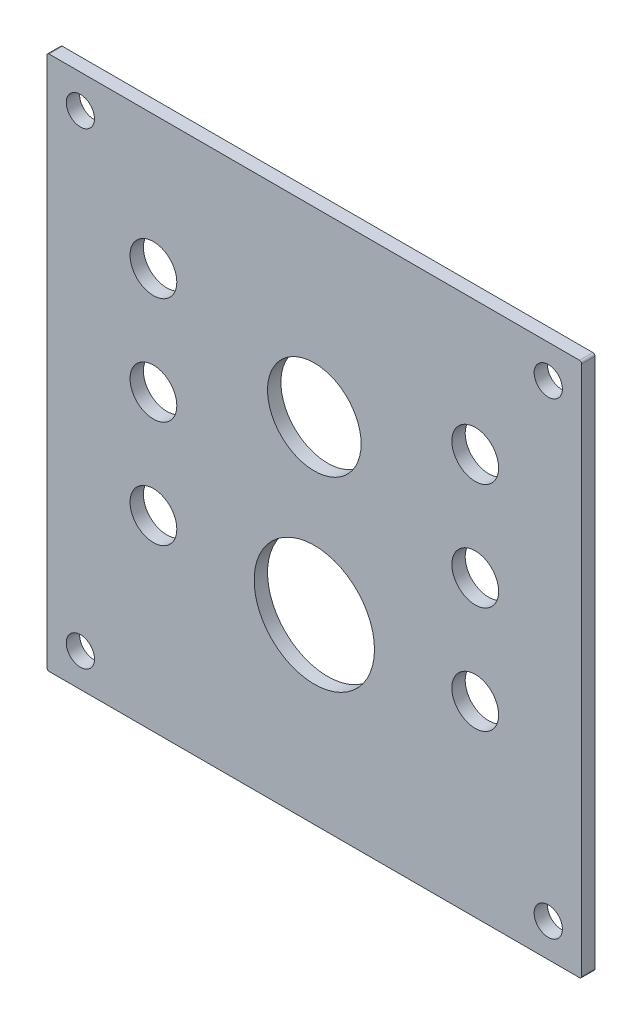
ISO-10303-21;
HEADER;
FILE_DESCRIPTION(('STEP AP214'),'2;1');
FILE_NAME('part.step','',(''),(''),'','','');
FILE_SCHEMA(('AUTOMOTIVE_DESIGN { 1 0 10303 214 1 1 1 1 }'));
ENDSEC;
DATA;
#1=APPLICATION_CONTEXT('core data for automotive mechanical design processes');
#2=APPLICATION_PROTOCOL_DEFINITION('international standard','automotive_design',2000,#1);
#3=PRODUCT_CONTEXT('',#1,'mechanical');
#4=PRODUCT('Part','Part','',(#3));
#5=PRODUCT_RELATED_PRODUCT_CATEGORY('part','',(#4));
#6=PRODUCT_DEFINITION_FORMATION('','',#4);
#7=PRODUCT_DEFINITION_CONTEXT('part definition',#1,'design');
#8=PRODUCT_DEFINITION('design','',#6,#7);
#9=PRODUCT_DEFINITION_SHAPE('','',#8);
#10=(LENGTH_UNIT() NAMED_UNIT(*) SI_UNIT(.MILLI.,.METRE.));
#11=(NAMED_UNIT(*) PLANE_ANGLE_UNIT() SI_UNIT($,.RADIAN.));
#12=(NAMED_UNIT(*) SI_UNIT($,.STERADIAN.) SOLID_ANGLE_UNIT());
#13=UNCERTAINTY_MEASURE_WITH_UNIT(LENGTH_MEASURE(1.E-05),#10,'distance_accuracy_value','');
#14=(GEOMETRIC_REPRESENTATION_CONTEXT(3) GLOBAL_UNCERTAINTY_ASSIGNED_CONTEXT((#13)) GLOBAL_UNIT_ASSIGNED_CONTEXT((#10,
#11,#12)) REPRESENTATION_CONTEXT('',''));
#15=CARTESIAN_POINT('',(0.,0.,0.));
#16=DIRECTION('',(0.,0.,1.));
#17=DIRECTION('',(1.,0.,0.));
#18=AXIS2_PLACEMENT_3D('',#15,#16,#17);
#19=CARTESIAN_POINT('',(-63.5,63.5,11.5875));
#20=DIRECTION('',(1.,0.,0.));
#21=DIRECTION('',(0.,1.,0.));
#22=AXIS2_PLACEMENT_3D('',#19,#20,#21);
#23=PLANE('',#22);
#24=DIRECTION('',(0.,-1.,0.));
#25=VECTOR('',#24,1.);
#26=CARTESIAN_POINT('',(-63.5,63.5,8.4125));
#27=LINE('',#26,#25);
#28=CARTESIAN_POINT('',(-63.5,62.992,8.4125));
#29=VERTEX_POINT('',#28);
#30=CARTESIAN_POINT('',(-63.5,-62.992,8.4125));
#31=VERTEX_POINT('',#30);
#32=EDGE_CURVE('E113',#29,#31,#27,.T.);
#33=ORIENTED_EDGE('',*,*,#32,.T.);
#34=DIRECTION('',(0.,0.,-1.));
#35=VECTOR('',#34,1.);
#36=CARTESIAN_POINT('',(-63.5,-62.992,11.5875));
#37=LINE('',#36,#35);
#38=CARTESIAN_POINT('',(-63.5,-62.992,11.5875));
#39=VERTEX_POINT('',#38);
#40=EDGE_CURVE('E57',#31,#39,#37,.F.);
#41=ORIENTED_EDGE('',*,*,#40,.T.);
#42=DIRECTION('',(0.,-1.,0.));
#43=VECTOR('',#42,1.);
#44=CARTESIAN_POINT('',(-63.5,63.5,11.5875));
#45=LINE('',#44,#43);
#46=CARTESIAN_POINT('',(-63.5,62.992,11.5875));
#47=VERTEX_POINT('',#46);
#48=EDGE_CURVE('E190',#47,#39,#45,.T.);
#49=ORIENTED_EDGE('',*,*,#48,.F.);
#50=DIRECTION('',(0.,0.,-1.));
#51=VECTOR('',#50,1.);
#52=CARTESIAN_POINT('',(-63.5,62.992,11.5875));
#53=LINE('',#52,#51);
#54=EDGE_CURVE('E203',#47,#29,#53,.T.);
#55=ORIENTED_EDGE('',*,*,#54,.T.);
#56=EDGE_LOOP('',(#33,#41,#49,#55));
#57=FACE_BOUND('',#56,.T.);
#58=ADVANCED_FACE('F36',(#57),#23,.F.);
#59=CARTESIAN_POINT('',(-63.5,-63.5,11.5875));
#60=DIRECTION('',(0.,1.,0.));
#61=DIRECTION('',(-1.,0.,0.));
#62=AXIS2_PLACEMENT_3D('',#59,#60,#61);
#63=PLANE('',#62);
#64=DIRECTION('',(1.,0.,0.));
#65=VECTOR('',#64,1.);
#66=CARTESIAN_POINT('',(-63.5,-63.5,11.5875));
#67=LINE('',#66,#65);
#68=CARTESIAN_POINT('',(-62.992,-63.5,11.5875));
#69=VERTEX_POINT('',#68);
#70=CARTESIAN_POINT('',(62.992,-63.5,11.5875));
#71=VERTEX_POINT('',#70);
#72=EDGE_CURVE('E192',#69,#71,#67,.T.);
#73=ORIENTED_EDGE('',*,*,#72,.F.);
#74=DIRECTION('',(0.,0.,-1.));
#75=VECTOR('',#74,1.);
#76=CARTESIAN_POINT('',(-62.992,-63.5,11.5875));
#77=LINE('',#76,#75);
#78=CARTESIAN_POINT('',(-62.992,-63.5,8.4125));
#79=VERTEX_POINT('',#78);
#80=EDGE_CURVE('E110',#69,#79,#77,.T.);
#81=ORIENTED_EDGE('',*,*,#80,.T.);
#82=DIRECTION('',(1.,0.,0.));
#83=VECTOR('',#82,1.);
#84=CARTESIAN_POINT('',(-63.5,-63.5,8.4125));
#85=LINE('',#84,#83);
#86=CARTESIAN_POINT('',(62.992,-63.5,8.4125));
#87=VERTEX_POINT('',#86);
#88=EDGE_CURVE('E103',#79,#87,#85,.T.);
#89=ORIENTED_EDGE('',*,*,#88,.T.);
#90=DIRECTION('',(0.,0.,-1.));
#91=VECTOR('',#90,1.);
#92=CARTESIAN_POINT('',(62.992,-63.5,11.5875));
#93=LINE('',#92,#91);
#94=EDGE_CURVE('E108',#71,#87,#93,.T.);
#95=ORIENTED_EDGE('',*,*,#94,.F.);
#96=EDGE_LOOP('',(#73,#81,#89,#95));
#97=FACE_BOUND('',#96,.T.);
#98=ADVANCED_FACE('F106',(#97),#63,.F.);
#99=CARTESIAN_POINT('',(0.,63.5,11.5875));
#100=DIRECTION('',(0.,-1.,0.));
#101=DIRECTION('',(1.,0.,0.));
#102=AXIS2_PLACEMENT_3D('',#99,#100,#101);
#103=PLANE('',#102);
#104=DIRECTION('',(-1.,0.,0.));
#105=VECTOR('',#104,1.);
#106=CARTESIAN_POINT('',(0.,63.5,8.4125));
#107=LINE('',#106,#105);
#108=CARTESIAN_POINT('',(62.992,63.5,8.4125));
#109=VERTEX_POINT('',#108);
#110=CARTESIAN_POINT('',(-62.992,63.5,8.4125));
#111=VERTEX_POINT('',#110);
#112=EDGE_CURVE('E112',#109,#111,#107,.T.);
#113=ORIENTED_EDGE('',*,*,#112,.T.);
#114=DIRECTION('',(0.,0.,-1.));
#115=VECTOR('',#114,1.);
#116=CARTESIAN_POINT('',(-62.992,63.5,11.5875));
#117=LINE('',#116,#115);
#118=CARTESIAN_POINT('',(-62.992,63.5,11.5875));
#119=VERTEX_POINT('',#118);
#120=EDGE_CURVE('E11',#111,#119,#117,.F.);
#121=ORIENTED_EDGE('',*,*,#120,.T.);
#122=DIRECTION('',(-1.,0.,0.));
#123=VECTOR('',#122,1.);
#124=CARTESIAN_POINT('',(0.,63.5,11.5875));
#125=LINE('',#124,#123);
#126=CARTESIAN_POINT('',(62.992,63.5,11.5875));
#127=VERTEX_POINT('',#126);
#128=EDGE_CURVE('E194',#127,#119,#125,.T.);
#129=ORIENTED_EDGE('',*,*,#128,.F.);
#130=DIRECTION('',(0.,0.,-1.));
#131=VECTOR('',#130,1.);
#132=CARTESIAN_POINT('',(62.992,63.5,11.5875));
#133=LINE('',#132,#131);
#134=EDGE_CURVE('E145',#109,#127,#133,.F.);
#135=ORIENTED_EDGE('',*,*,#134,.F.);
#136=EDGE_LOOP('',(#113,#121,#129,#135));
#137=FACE_BOUND('',#136,.T.);
#138=ADVANCED_FACE('F219',(#137),#103,.F.);
#139=CARTESIAN_POINT('',(-63.5,-63.5,11.5875));
#140=DIRECTION('',(0.,0.,1.));
#141=DIRECTION('',(1.,0.,0.));
#142=AXIS2_PLACEMENT_3D('',#139,#140,#141);
#143=PLANE('',#142);
#144=CARTESIAN_POINT('',(0.,-20.3454,11.5875));
#145=DIRECTION('',(0.,0.,1.));
#146=DIRECTION('',(1.,0.,0.));
#147=AXIS2_PLACEMENT_3D('',#144,#145,#146);
#148=CIRCLE('',#147,14.2875);
#149=CARTESIAN_POINT('',(14.2875,-20.3454,11.5875));
#150=VERTEX_POINT('',#149);
#151=EDGE_CURVE('E170',#150,#150,#148,.T.);
#152=ORIENTED_EDGE('',*,*,#151,.F.);
#153=EDGE_LOOP('',(#152));
#154=FACE_BOUND('',#153,.T.);
#155=CARTESIAN_POINT('',(0.,20.3454,11.5875));
#156=DIRECTION('',(0.,0.,1.));
#157=DIRECTION('',(1.,0.,0.));
#158=AXIS2_PLACEMENT_3D('',#155,#156,#157);
#159=CIRCLE('',#158,11.1125);
#160=CARTESIAN_POINT('',(11.1125,20.3454,11.5875));
#161=VERTEX_POINT('',#160);
#162=EDGE_CURVE('E176',#161,#161,#159,.T.);
#163=ORIENTED_EDGE('',*,*,#162,.F.);
#164=EDGE_LOOP('',(#163));
#165=FACE_BOUND('',#164,.T.);
#166=CARTESIAN_POINT('',(-38.2148079999995,-19.05,11.5875));
#167=DIRECTION('',(0.,0.,1.));
#168=DIRECTION('',(1.,0.,0.));
#169=AXIS2_PLACEMENT_3D('',#166,#167,#168);
#170=CIRCLE('',#169,5.55625);
#171=CARTESIAN_POINT('',(-32.6585579999995,-19.05,11.5875));
#172=VERTEX_POINT('',#171);
#173=EDGE_CURVE('E148',#172,#172,#170,.T.);
#174=ORIENTED_EDGE('',*,*,#173,.F.);
#175=EDGE_LOOP('',(#174));
#176=FACE_BOUND('',#175,.T.);
#177=CARTESIAN_POINT('',(-55.5625,55.5625,11.5875));
#178=DIRECTION('',(0.,0.,1.));
#179=DIRECTION('',(1.,0.,0.));
#180=AXIS2_PLACEMENT_3D('',#177,#178,#179);
#181=CIRCLE('',#180,3.3528);
#182=CARTESIAN_POINT('',(-52.2097,55.5625,11.5875));
#183=VERTEX_POINT('',#182);
#184=EDGE_CURVE('E152',#183,#183,#181,.T.);
#185=ORIENTED_EDGE('',*,*,#184,.F.);
#186=EDGE_LOOP('',(#185));
#187=FACE_BOUND('',#186,.T.);
#188=CARTESIAN_POINT('',(-38.2148079999999,31.75,11.5875));
#189=DIRECTION('',(0.,0.,1.));
#190=DIRECTION('',(1.,0.,0.));
#191=AXIS2_PLACEMENT_3D('',#188,#189,#190);
#192=CIRCLE('',#191,5.55624999999993);
#193=CARTESIAN_POINT('',(-32.658558,31.75,11.5875));
#194=VERTEX_POINT('',#193);
#195=EDGE_CURVE('E158',#194,#194,#192,.T.);
#196=ORIENTED_EDGE('',*,*,#195,.F.);
#197=EDGE_LOOP('',(#196));
#198=FACE_BOUND('',#197,.T.);
#199=CARTESIAN_POINT('',(-38.2148079999999,6.34999999999999,11.5875));
#200=DIRECTION('',(0.,0.,1.));
#201=DIRECTION('',(1.,0.,0.));
#202=AXIS2_PLACEMENT_3D('',#199,#200,#201);
#203=CIRCLE('',#202,5.55625000000017);
#204=CARTESIAN_POINT('',(-32.6585579999998,6.34999999999999,11.5875));
#205=VERTEX_POINT('',#204);
#206=EDGE_CURVE('E164',#205,#205,#203,.T.);
#207=ORIENTED_EDGE('',*,*,#206,.F.);
#208=EDGE_LOOP('',(#207));
#209=FACE_BOUND('',#208,.T.);
#210=ORIENTED_EDGE('',*,*,#48,.T.);
#211=CARTESIAN_POINT('',(-62.992,-62.992,11.5875));
#212=DIRECTION('',(0.,0.,1.));
#213=DIRECTION('',(1.,0.,0.));
#214=AXIS2_PLACEMENT_3D('',#211,#212,#213);
#215=CIRCLE('',#214,0.508);
#216=EDGE_CURVE('E44',#39,#69,#215,.T.);
#217=ORIENTED_EDGE('',*,*,#216,.T.);
#218=ORIENTED_EDGE('',*,*,#72,.T.);
#219=CARTESIAN_POINT('',(62.992,-62.992,11.5875));
#220=DIRECTION('',(0.,0.,-1.));
#221=DIRECTION('',(-1.,0.,0.));
#222=AXIS2_PLACEMENT_3D('',#219,#220,#221);
#223=CIRCLE('',#222,0.508);
#224=CARTESIAN_POINT('',(63.5,-62.992,11.5875));
#225=VERTEX_POINT('',#224);
#226=EDGE_CURVE('E129',#225,#71,#223,.T.);
#227=ORIENTED_EDGE('',*,*,#226,.F.);
#228=DIRECTION('',(0.,-1.,0.));
#229=VECTOR('',#228,1.);
#230=CARTESIAN_POINT('',(63.5,63.5,11.5875));
#231=LINE('',#230,#229);
#232=CARTESIAN_POINT('',(63.5,62.992,11.5875));
#233=VERTEX_POINT('',#232);
#234=EDGE_CURVE('E130',#233,#225,#231,.T.);
#235=ORIENTED_EDGE('',*,*,#234,.F.);
#236=CARTESIAN_POINT('',(62.992,62.992,11.5875));
#237=DIRECTION('',(0.,0.,-1.));
#238=DIRECTION('',(-1.,0.,0.));
#239=AXIS2_PLACEMENT_3D('',#236,#237,#238);
#240=CIRCLE('',#239,0.508);
#241=EDGE_CURVE('E142',#127,#233,#240,.T.);
#242=ORIENTED_EDGE('',*,*,#241,.F.);
#243=ORIENTED_EDGE('',*,*,#128,.T.);
#244=CARTESIAN_POINT('',(-62.992,62.992,11.5875));
#245=DIRECTION('',(0.,0.,1.));
#246=DIRECTION('',(1.,0.,0.));
#247=AXIS2_PLACEMENT_3D('',#244,#245,#246);
#248=CIRCLE('',#247,0.508);
#249=EDGE_CURVE('E207',#119,#47,#248,.T.);
#250=ORIENTED_EDGE('',*,*,#249,.T.);
#251=EDGE_LOOP('',(#210,#217,#218,#227,#235,#242,#243,#250));
#252=FACE_BOUND('',#251,.T.);
#253=CARTESIAN_POINT('',(-55.5625,-55.5625,11.5875));
#254=DIRECTION('',(0.,0.,1.));
#255=DIRECTION('',(-1.,0.,0.));
#256=AXIS2_PLACEMENT_3D('',#253,#254,#255);
#257=CIRCLE('',#256,3.3528);
#258=CARTESIAN_POINT('',(-58.9153,-55.5625,11.5875));
#259=VERTEX_POINT('',#258);
#260=EDGE_CURVE('E182',#259,#259,#257,.T.);
#261=ORIENTED_EDGE('',*,*,#260,.F.);
#262=EDGE_LOOP('',(#261));
#263=FACE_BOUND('',#262,.T.);
#264=CARTESIAN_POINT('',(38.2148079999995,-19.05,11.5875));
#265=DIRECTION('',(0.,0.,-1.));
#266=DIRECTION('',(-1.,0.,0.));
#267=AXIS2_PLACEMENT_3D('',#264,#265,#266);
#268=CIRCLE('',#267,5.55625);
#269=CARTESIAN_POINT('',(32.6585579999995,-19.05,11.5875));
#270=VERTEX_POINT('',#269);
#271=EDGE_CURVE('E255',#270,#270,#268,.T.);
#272=ORIENTED_EDGE('',*,*,#271,.T.);
#273=EDGE_LOOP('',(#272));
#274=FACE_BOUND('',#273,.T.);
#275=CARTESIAN_POINT('',(55.5625,55.5625,11.5875));
#276=DIRECTION('',(0.,0.,-1.));
#277=DIRECTION('',(-1.,0.,0.));
#278=AXIS2_PLACEMENT_3D('',#275,#276,#277);
#279=CIRCLE('',#278,3.3528);
#280=CARTESIAN_POINT('',(52.2097,55.5625,11.5875));
#281=VERTEX_POINT('',#280);
#282=EDGE_CURVE('E249',#281,#281,#279,.T.);
#283=ORIENTED_EDGE('',*,*,#282,.T.);
#284=EDGE_LOOP('',(#283));
#285=FACE_BOUND('',#284,.T.);
#286=CARTESIAN_POINT('',(38.2148079999999,31.75,11.5875));
#287=DIRECTION('',(0.,0.,-1.));
#288=DIRECTION('',(-1.,0.,0.));
#289=AXIS2_PLACEMENT_3D('',#286,#287,#288);
#290=CIRCLE('',#289,5.55624999999993);
#291=CARTESIAN_POINT('',(32.658558,31.75,11.5875));
#292=VERTEX_POINT('',#291);
#293=EDGE_CURVE('E243',#292,#292,#290,.T.);
#294=ORIENTED_EDGE('',*,*,#293,.T.);
#295=EDGE_LOOP('',(#294));
#296=FACE_BOUND('',#295,.T.);
#297=CARTESIAN_POINT('',(38.2148079999999,6.34999999999999,11.5875));
#298=DIRECTION('',(0.,0.,-1.));
#299=DIRECTION('',(-1.,0.,0.));
#300=AXIS2_PLACEMENT_3D('',#297,#298,#299);
#301=CIRCLE('',#300,5.55625000000017);
#302=CARTESIAN_POINT('',(32.6585579999998,6.34999999999999,11.5875));
#303=VERTEX_POINT('',#302);
#304=EDGE_CURVE('E237',#303,#303,#301,.T.);
#305=ORIENTED_EDGE('',*,*,#304,.T.);
#306=EDGE_LOOP('',(#305));
#307=FACE_BOUND('',#306,.T.);
#308=CARTESIAN_POINT('',(55.5625,-55.5625,11.5875));
#309=DIRECTION('',(0.,0.,-1.));
#310=DIRECTION('',(1.,0.,0.));
#311=AXIS2_PLACEMENT_3D('',#308,#309,#310);
#312=CIRCLE('',#311,3.3528);
#313=CARTESIAN_POINT('',(58.9153,-55.5625,11.5875));
#314=VERTEX_POINT('',#313);
#315=EDGE_CURVE('E229',#314,#314,#312,.T.);
#316=ORIENTED_EDGE('',*,*,#315,.T.);
#317=EDGE_LOOP('',(#316));
#318=FACE_BOUND('',#317,.T.);
#319=ADVANCED_FACE('F210',(#154,#165,#176,#187,#198,#209,#252,#263,#274,#285,#296,#307,#318),
#143,.T.);
#320=CARTESIAN_POINT('',(-63.5,-63.5,8.4125));
#321=DIRECTION('',(0.,0.,1.));
#322=DIRECTION('',(1.,0.,0.));
#323=AXIS2_PLACEMENT_3D('',#320,#321,#322);
#324=PLANE('',#323);
#325=CARTESIAN_POINT('',(0.,-20.3454,8.4125));
#326=DIRECTION('',(0.,0.,1.));
#327=DIRECTION('',(1.,0.,0.));
#328=AXIS2_PLACEMENT_3D('',#325,#326,#327);
#329=CIRCLE('',#328,14.2875);
#330=CARTESIAN_POINT('',(14.2875,-20.3454,8.4125));
#331=VERTEX_POINT('',#330);
#332=EDGE_CURVE('E173',#331,#331,#329,.T.);
#333=ORIENTED_EDGE('',*,*,#332,.T.);
#334=EDGE_LOOP('',(#333));
#335=FACE_BOUND('',#334,.T.);
#336=CARTESIAN_POINT('',(0.,20.3454,8.4125));
#337=DIRECTION('',(0.,0.,1.));
#338=DIRECTION('',(1.,0.,0.));
#339=AXIS2_PLACEMENT_3D('',#336,#337,#338);
#340=CIRCLE('',#339,11.1125);
#341=CARTESIAN_POINT('',(11.1125,20.3454,8.4125));
#342=VERTEX_POINT('',#341);
#343=EDGE_CURVE('E179',#342,#342,#340,.T.);
#344=ORIENTED_EDGE('',*,*,#343,.T.);
#345=EDGE_LOOP('',(#344));
#346=FACE_BOUND('',#345,.T.);
#347=CARTESIAN_POINT('',(-38.2148079999995,-19.05,8.4125));
#348=DIRECTION('',(0.,0.,1.));
#349=DIRECTION('',(1.,0.,0.));
#350=AXIS2_PLACEMENT_3D('',#347,#348,#349);
#351=CIRCLE('',#350,5.55625);
#352=CARTESIAN_POINT('',(-32.6585579999995,-19.05,8.4125));
#353=VERTEX_POINT('',#352);
#354=EDGE_CURVE('E149',#353,#353,#351,.T.);
#355=ORIENTED_EDGE('',*,*,#354,.T.);
#356=EDGE_LOOP('',(#355));
#357=FACE_BOUND('',#356,.T.);
#358=CARTESIAN_POINT('',(-55.5625,55.5625,8.4125));
#359=DIRECTION('',(0.,0.,1.));
#360=DIRECTION('',(1.,0.,0.));
#361=AXIS2_PLACEMENT_3D('',#358,#359,#360);
#362=CIRCLE('',#361,3.3528);
#363=CARTESIAN_POINT('',(-52.2097,55.5625,8.4125));
#364=VERTEX_POINT('',#363);
#365=EDGE_CURVE('E155',#364,#364,#362,.T.);
#366=ORIENTED_EDGE('',*,*,#365,.T.);
#367=EDGE_LOOP('',(#366));
#368=FACE_BOUND('',#367,.T.);
#369=CARTESIAN_POINT('',(-38.2148079999999,31.75,8.4125));
#370=DIRECTION('',(0.,0.,1.));
#371=DIRECTION('',(1.,0.,0.));
#372=AXIS2_PLACEMENT_3D('',#369,#370,#371);
#373=CIRCLE('',#372,5.55624999999993);
#374=CARTESIAN_POINT('',(-32.658558,31.75,8.4125));
#375=VERTEX_POINT('',#374);
#376=EDGE_CURVE('E161',#375,#375,#373,.T.);
#377=ORIENTED_EDGE('',*,*,#376,.T.);
#378=EDGE_LOOP('',(#377));
#379=FACE_BOUND('',#378,.T.);
#380=CARTESIAN_POINT('',(-38.2148079999999,6.34999999999999,8.4125));
#381=DIRECTION('',(0.,0.,1.));
#382=DIRECTION('',(1.,0.,0.));
#383=AXIS2_PLACEMENT_3D('',#380,#381,#382);
#384=CIRCLE('',#383,5.55625000000017);
#385=CARTESIAN_POINT('',(-32.6585579999998,6.34999999999999,8.4125));
#386=VERTEX_POINT('',#385);
#387=EDGE_CURVE('E167',#386,#386,#384,.T.);
#388=ORIENTED_EDGE('',*,*,#387,.T.);
#389=EDGE_LOOP('',(#388));
#390=FACE_BOUND('',#389,.T.);
#391=CARTESIAN_POINT('',(-55.5625,-55.5625,8.4125));
#392=DIRECTION('',(0.,0.,1.));
#393=DIRECTION('',(-1.,0.,0.));
#394=AXIS2_PLACEMENT_3D('',#391,#392,#393);
#395=CIRCLE('',#394,3.3528);
#396=CARTESIAN_POINT('',(-58.9153,-55.5625,8.4125));
#397=VERTEX_POINT('',#396);
#398=EDGE_CURVE('E185',#397,#397,#395,.T.);
#399=ORIENTED_EDGE('',*,*,#398,.T.);
#400=EDGE_LOOP('',(#399));
#401=FACE_BOUND('',#400,.T.);
#402=ORIENTED_EDGE('',*,*,#88,.F.);
#403=CARTESIAN_POINT('',(-62.992,-62.992,8.4125));
#404=DIRECTION('',(0.,0.,1.));
#405=DIRECTION('',(1.,0.,0.));
#406=AXIS2_PLACEMENT_3D('',#403,#404,#405);
#407=CIRCLE('',#406,0.508);
#408=EDGE_CURVE('E201',#79,#31,#407,.F.);
#409=ORIENTED_EDGE('',*,*,#408,.T.);
#410=ORIENTED_EDGE('',*,*,#32,.F.);
#411=CARTESIAN_POINT('',(-62.992,62.992,8.4125));
#412=DIRECTION('',(0.,0.,1.));
#413=DIRECTION('',(1.,0.,0.));
#414=AXIS2_PLACEMENT_3D('',#411,#412,#413);
#415=CIRCLE('',#414,0.508);
#416=EDGE_CURVE('E199',#29,#111,#415,.F.);
#417=ORIENTED_EDGE('',*,*,#416,.T.);
#418=ORIENTED_EDGE('',*,*,#112,.F.);
#419=CARTESIAN_POINT('',(62.992,62.992,8.4125));
#420=DIRECTION('',(0.,0.,-1.));
#421=DIRECTION('',(-1.,0.,0.));
#422=AXIS2_PLACEMENT_3D('',#419,#420,#421);
#423=CIRCLE('',#422,0.508);
#424=CARTESIAN_POINT('',(63.5,62.992,8.4125));
#425=VERTEX_POINT('',#424);
#426=EDGE_CURVE('E125',#425,#109,#423,.F.);
#427=ORIENTED_EDGE('',*,*,#426,.F.);
#428=DIRECTION('',(0.,-1.,0.));
#429=VECTOR('',#428,1.);
#430=CARTESIAN_POINT('',(63.5,63.5,8.4125));
#431=LINE('',#430,#429);
#432=CARTESIAN_POINT('',(63.5,-62.992,8.4125));
#433=VERTEX_POINT('',#432);
#434=EDGE_CURVE('E120',#425,#433,#431,.T.);
#435=ORIENTED_EDGE('',*,*,#434,.T.);
#436=CARTESIAN_POINT('',(62.992,-62.992,8.4125));
#437=DIRECTION('',(0.,0.,-1.));
#438=DIRECTION('',(-1.,0.,0.));
#439=AXIS2_PLACEMENT_3D('',#436,#437,#438);
#440=CIRCLE('',#439,0.508);
#441=EDGE_CURVE('E116',#87,#433,#440,.F.);
#442=ORIENTED_EDGE('',*,*,#441,.F.);
#443=EDGE_LOOP('',(#402,#409,#410,#417,#418,#427,#435,#442));
#444=FACE_BOUND('',#443,.T.);
#445=CARTESIAN_POINT('',(38.2148079999995,-19.05,8.4125));
#446=DIRECTION('',(0.,0.,-1.));
#447=DIRECTION('',(-1.,0.,0.));
#448=AXIS2_PLACEMENT_3D('',#445,#446,#447);
#449=CIRCLE('',#448,5.55625);
#450=CARTESIAN_POINT('',(32.6585579999995,-19.05,8.4125));
#451=VERTEX_POINT('',#450);
#452=EDGE_CURVE('E252',#451,#451,#449,.T.);
#453=ORIENTED_EDGE('',*,*,#452,.F.);
#454=EDGE_LOOP('',(#453));
#455=FACE_BOUND('',#454,.T.);
#456=CARTESIAN_POINT('',(55.5625,55.5625,8.4125));
#457=DIRECTION('',(0.,0.,-1.));
#458=DIRECTION('',(-1.,0.,0.));
#459=AXIS2_PLACEMENT_3D('',#456,#457,#458);
#460=CIRCLE('',#459,3.3528);
#461=CARTESIAN_POINT('',(52.2097,55.5625,8.4125));
#462=VERTEX_POINT('',#461);
#463=EDGE_CURVE('E246',#462,#462,#460,.T.);
#464=ORIENTED_EDGE('',*,*,#463,.F.);
#465=EDGE_LOOP('',(#464));
#466=FACE_BOUND('',#465,.T.);
#467=CARTESIAN_POINT('',(38.2148079999999,31.75,8.4125));
#468=DIRECTION('',(0.,0.,-1.));
#469=DIRECTION('',(-1.,0.,0.));
#470=AXIS2_PLACEMENT_3D('',#467,#468,#469);
#471=CIRCLE('',#470,5.55624999999993);
#472=CARTESIAN_POINT('',(32.658558,31.75,8.4125));
#473=VERTEX_POINT('',#472);
#474=EDGE_CURVE('E240',#473,#473,#471,.T.);
#475=ORIENTED_EDGE('',*,*,#474,.F.);
#476=EDGE_LOOP('',(#475));
#477=FACE_BOUND('',#476,.T.);
#478=CARTESIAN_POINT('',(38.2148079999999,6.34999999999999,8.4125));
#479=DIRECTION('',(0.,0.,-1.));
#480=DIRECTION('',(-1.,0.,0.));
#481=AXIS2_PLACEMENT_3D('',#478,#479,#480);
#482=CIRCLE('',#481,5.55625000000017);
#483=CARTESIAN_POINT('',(32.6585579999998,6.34999999999999,8.4125));
#484=VERTEX_POINT('',#483);
#485=EDGE_CURVE('E234',#484,#484,#482,.T.);
#486=ORIENTED_EDGE('',*,*,#485,.F.);
#487=EDGE_LOOP('',(#486));
#488=FACE_BOUND('',#487,.T.);
#489=CARTESIAN_POINT('',(55.5625,-55.5625,8.4125));
#490=DIRECTION('',(0.,0.,-1.));
#491=DIRECTION('',(1.,0.,0.));
#492=AXIS2_PLACEMENT_3D('',#489,#490,#491);
#493=CIRCLE('',#492,3.3528);
#494=CARTESIAN_POINT('',(58.9153,-55.5625,8.4125));
#495=VERTEX_POINT('',#494);
#496=EDGE_CURVE('E227',#495,#495,#493,.T.);
#497=ORIENTED_EDGE('',*,*,#496,.F.);
#498=EDGE_LOOP('',(#497));
#499=FACE_BOUND('',#498,.T.);
#500=ADVANCED_FACE('F117',(#335,#346,#357,#368,#379,#390,#401,#444,#455,#466,#477,#488,#499),
#324,.F.);
#501=CARTESIAN_POINT('',(-55.5625,-55.5625,8.4125));
#502=DIRECTION('',(0.,0.,1.));
#503=DIRECTION('',(1.,0.,0.));
#504=AXIS2_PLACEMENT_3D('',#501,#502,#503);
#505=CYLINDRICAL_SURFACE('',#504,3.3528);
#506=ORIENTED_EDGE('',*,*,#398,.F.);
#507=EDGE_LOOP('',(#506));
#508=FACE_BOUND('',#507,.T.);
#509=ORIENTED_EDGE('',*,*,#260,.T.);
#510=EDGE_LOOP('',(#509));
#511=FACE_BOUND('',#510,.T.);
#512=ADVANCED_FACE('F265',(#508,#511),#505,.F.);
#513=CARTESIAN_POINT('',(0.,20.3454,8.4125));
#514=DIRECTION('',(0.,0.,1.));
#515=DIRECTION('',(1.,0.,0.));
#516=AXIS2_PLACEMENT_3D('',#513,#514,#515);
#517=CYLINDRICAL_SURFACE('',#516,11.1125);
#518=ORIENTED_EDGE('',*,*,#162,.T.);
#519=EDGE_LOOP('',(#518));
#520=FACE_BOUND('',#519,.T.);
#521=ORIENTED_EDGE('',*,*,#343,.F.);
#522=EDGE_LOOP('',(#521));
#523=FACE_BOUND('',#522,.T.);
#524=ADVANCED_FACE('F332',(#520,#523),#517,.F.);
#525=CARTESIAN_POINT('',(0.,-20.3454,8.4125));
#526=DIRECTION('',(0.,0.,1.));
#527=DIRECTION('',(1.,0.,0.));
#528=AXIS2_PLACEMENT_3D('',#525,#526,#527);
#529=CYLINDRICAL_SURFACE('',#528,14.2875);
#530=ORIENTED_EDGE('',*,*,#151,.T.);
#531=EDGE_LOOP('',(#530));
#532=FACE_BOUND('',#531,.T.);
#533=ORIENTED_EDGE('',*,*,#332,.F.);
#534=EDGE_LOOP('',(#533));
#535=FACE_BOUND('',#534,.T.);
#536=ADVANCED_FACE('F328',(#532,#535),#529,.F.);
#537=CARTESIAN_POINT('',(-38.2148079999999,6.34999999999999,8.4125));
#538=DIRECTION('',(0.,0.,1.));
#539=DIRECTION('',(1.,0.,0.));
#540=AXIS2_PLACEMENT_3D('',#537,#538,#539);
#541=CYLINDRICAL_SURFACE('',#540,5.55625000000017);
#542=ORIENTED_EDGE('',*,*,#387,.F.);
#543=EDGE_LOOP('',(#542));
#544=FACE_BOUND('',#543,.T.);
#545=ORIENTED_EDGE('',*,*,#206,.T.);
#546=EDGE_LOOP('',(#545));
#547=FACE_BOUND('',#546,.T.);
#548=ADVANCED_FACE('F324',(#544,#547),#541,.F.);
#549=CARTESIAN_POINT('',(-38.2148079999999,31.75,8.4125));
#550=DIRECTION('',(0.,0.,1.));
#551=DIRECTION('',(1.,0.,0.));
#552=AXIS2_PLACEMENT_3D('',#549,#550,#551);
#553=CYLINDRICAL_SURFACE('',#552,5.55624999999993);
#554=ORIENTED_EDGE('',*,*,#376,.F.);
#555=EDGE_LOOP('',(#554));
#556=FACE_BOUND('',#555,.T.);
#557=ORIENTED_EDGE('',*,*,#195,.T.);
#558=EDGE_LOOP('',(#557));
#559=FACE_BOUND('',#558,.T.);
#560=ADVANCED_FACE('F314',(#556,#559),#553,.F.);
#561=CARTESIAN_POINT('',(-55.5625,55.5625,8.4125));
#562=DIRECTION('',(0.,0.,1.));
#563=DIRECTION('',(1.,0.,0.));
#564=AXIS2_PLACEMENT_3D('',#561,#562,#563);
#565=CYLINDRICAL_SURFACE('',#564,3.3528);
#566=ORIENTED_EDGE('',*,*,#365,.F.);
#567=EDGE_LOOP('',(#566));
#568=FACE_BOUND('',#567,.T.);
#569=ORIENTED_EDGE('',*,*,#184,.T.);
#570=EDGE_LOOP('',(#569));
#571=FACE_BOUND('',#570,.T.);
#572=ADVANCED_FACE('F308',(#568,#571),#565,.F.);
#573=CARTESIAN_POINT('',(-38.2148079999995,-19.05,8.4125));
#574=DIRECTION('',(0.,0.,1.));
#575=DIRECTION('',(1.,0.,0.));
#576=AXIS2_PLACEMENT_3D('',#573,#574,#575);
#577=CYLINDRICAL_SURFACE('',#576,5.55625);
#578=ORIENTED_EDGE('',*,*,#354,.F.);
#579=EDGE_LOOP('',(#578));
#580=FACE_BOUND('',#579,.T.);
#581=ORIENTED_EDGE('',*,*,#173,.T.);
#582=EDGE_LOOP('',(#581));
#583=FACE_BOUND('',#582,.T.);
#584=ADVANCED_FACE('F303',(#580,#583),#577,.F.);
#585=CARTESIAN_POINT('',(-62.992,-62.992,11.5875));
#586=DIRECTION('',(0.,0.,-1.));
#587=DIRECTION('',(-1.,0.,0.));
#588=AXIS2_PLACEMENT_3D('',#585,#586,#587);
#589=CYLINDRICAL_SURFACE('',#588,0.508);
#590=ORIENTED_EDGE('',*,*,#216,.F.);
#591=ORIENTED_EDGE('',*,*,#40,.F.);
#592=ORIENTED_EDGE('',*,*,#408,.F.);
#593=ORIENTED_EDGE('',*,*,#80,.F.);
#594=EDGE_LOOP('',(#590,#591,#592,#593));
#595=FACE_BOUND('',#594,.T.);
#596=ADVANCED_FACE('F213',(#595),#589,.T.);
#597=CARTESIAN_POINT('',(-62.992,62.992,11.5875));
#598=DIRECTION('',(0.,0.,-1.));
#599=DIRECTION('',(-1.,0.,0.));
#600=AXIS2_PLACEMENT_3D('',#597,#598,#599);
#601=CYLINDRICAL_SURFACE('',#600,0.508);
#602=ORIENTED_EDGE('',*,*,#249,.F.);
#603=ORIENTED_EDGE('',*,*,#120,.F.);
#604=ORIENTED_EDGE('',*,*,#416,.F.);
#605=ORIENTED_EDGE('',*,*,#54,.F.);
#606=EDGE_LOOP('',(#602,#603,#604,#605));
#607=FACE_BOUND('',#606,.T.);
#608=ADVANCED_FACE('F38',(#607),#601,.T.);
#609=CARTESIAN_POINT('',(63.5,63.5,11.5875));
#610=DIRECTION('',(-1.,0.,0.));
#611=DIRECTION('',(0.,1.,0.));
#612=AXIS2_PLACEMENT_3D('',#609,#610,#611);
#613=PLANE('',#612);
#614=ORIENTED_EDGE('',*,*,#434,.F.);
#615=DIRECTION('',(0.,0.,-1.));
#616=VECTOR('',#615,1.);
#617=CARTESIAN_POINT('',(63.5,62.992,11.5875));
#618=LINE('',#617,#616);
#619=EDGE_CURVE('E124',#233,#425,#618,.T.);
#620=ORIENTED_EDGE('',*,*,#619,.F.);
#621=ORIENTED_EDGE('',*,*,#234,.T.);
#622=DIRECTION('',(0.,0.,-1.));
#623=VECTOR('',#622,1.);
#624=CARTESIAN_POINT('',(63.5,-62.992,11.5875));
#625=LINE('',#624,#623);
#626=EDGE_CURVE('E140',#433,#225,#625,.F.);
#627=ORIENTED_EDGE('',*,*,#626,.F.);
#628=EDGE_LOOP('',(#614,#620,#621,#627));
#629=FACE_BOUND('',#628,.T.);
#630=ADVANCED_FACE('F226',(#629),#613,.F.);
#631=CARTESIAN_POINT('',(55.5625,-55.5625,8.4125));
#632=DIRECTION('',(0.,0.,1.));
#633=DIRECTION('',(-1.,0.,0.));
#634=AXIS2_PLACEMENT_3D('',#631,#632,#633);
#635=CYLINDRICAL_SURFACE('',#634,3.3528);
#636=ORIENTED_EDGE('',*,*,#496,.T.);
#637=EDGE_LOOP('',(#636));
#638=FACE_BOUND('',#637,.T.);
#639=ORIENTED_EDGE('',*,*,#315,.F.);
#640=EDGE_LOOP('',(#639));
#641=FACE_BOUND('',#640,.T.);
#642=ADVANCED_FACE('F279',(#638,#641),#635,.F.);
#643=CARTESIAN_POINT('',(38.2148079999999,6.34999999999999,8.4125));
#644=DIRECTION('',(0.,0.,1.));
#645=DIRECTION('',(-1.,0.,0.));
#646=AXIS2_PLACEMENT_3D('',#643,#644,#645);
#647=CYLINDRICAL_SURFACE('',#646,5.55625000000017);
#648=ORIENTED_EDGE('',*,*,#485,.T.);
#649=EDGE_LOOP('',(#648));
#650=FACE_BOUND('',#649,.T.);
#651=ORIENTED_EDGE('',*,*,#304,.F.);
#652=EDGE_LOOP('',(#651));
#653=FACE_BOUND('',#652,.T.);
#654=ADVANCED_FACE('F275',(#650,#653),#647,.F.);
#655=CARTESIAN_POINT('',(38.2148079999999,31.75,8.4125));
#656=DIRECTION('',(0.,0.,1.));
#657=DIRECTION('',(-1.,0.,0.));
#658=AXIS2_PLACEMENT_3D('',#655,#656,#657);
#659=CYLINDRICAL_SURFACE('',#658,5.55624999999993);
#660=ORIENTED_EDGE('',*,*,#474,.T.);
#661=EDGE_LOOP('',(#660));
#662=FACE_BOUND('',#661,.T.);
#663=ORIENTED_EDGE('',*,*,#293,.F.);
#664=EDGE_LOOP('',(#663));
#665=FACE_BOUND('',#664,.T.);
#666=ADVANCED_FACE('F278',(#662,#665),#659,.F.);
#667=CARTESIAN_POINT('',(55.5625,55.5625,8.4125));
#668=DIRECTION('',(0.,0.,1.));
#669=DIRECTION('',(-1.,0.,0.));
#670=AXIS2_PLACEMENT_3D('',#667,#668,#669);
#671=CYLINDRICAL_SURFACE('',#670,3.3528);
#672=ORIENTED_EDGE('',*,*,#463,.T.);
#673=EDGE_LOOP('',(#672));
#674=FACE_BOUND('',#673,.T.);
#675=ORIENTED_EDGE('',*,*,#282,.F.);
#676=EDGE_LOOP('',(#675));
#677=FACE_BOUND('',#676,.T.);
#678=ADVANCED_FACE('F451',(#674,#677),#671,.F.);
#679=CARTESIAN_POINT('',(38.2148079999995,-19.05,8.4125));
#680=DIRECTION('',(0.,0.,1.));
#681=DIRECTION('',(-1.,0.,0.));
#682=AXIS2_PLACEMENT_3D('',#679,#680,#681);
#683=CYLINDRICAL_SURFACE('',#682,5.55625);
#684=ORIENTED_EDGE('',*,*,#452,.T.);
#685=EDGE_LOOP('',(#684));
#686=FACE_BOUND('',#685,.T.);
#687=ORIENTED_EDGE('',*,*,#271,.F.);
#688=EDGE_LOOP('',(#687));
#689=FACE_BOUND('',#688,.T.);
#690=ADVANCED_FACE('F261',(#686,#689),#683,.F.);
#691=CARTESIAN_POINT('',(62.992,-62.992,11.5875));
#692=DIRECTION('',(0.,0.,-1.));
#693=DIRECTION('',(1.,0.,0.));
#694=AXIS2_PLACEMENT_3D('',#691,#692,#693);
#695=CYLINDRICAL_SURFACE('',#694,0.508);
#696=ORIENTED_EDGE('',*,*,#226,.T.);
#697=ORIENTED_EDGE('',*,*,#94,.T.);
#698=ORIENTED_EDGE('',*,*,#441,.T.);
#699=ORIENTED_EDGE('',*,*,#626,.T.);
#700=EDGE_LOOP('',(#696,#697,#698,#699));
#701=FACE_BOUND('',#700,.T.);
#702=ADVANCED_FACE('F128',(#701),#695,.T.);
#703=CARTESIAN_POINT('',(62.992,62.992,11.5875));
#704=DIRECTION('',(0.,0.,-1.));
#705=DIRECTION('',(1.,0.,0.));
#706=AXIS2_PLACEMENT_3D('',#703,#704,#705);
#707=CYLINDRICAL_SURFACE('',#706,0.508);
#708=ORIENTED_EDGE('',*,*,#241,.T.);
#709=ORIENTED_EDGE('',*,*,#619,.T.);
#710=ORIENTED_EDGE('',*,*,#426,.T.);
#711=ORIENTED_EDGE('',*,*,#134,.T.);
#712=EDGE_LOOP('',(#708,#709,#710,#711));
#713=FACE_BOUND('',#712,.T.);
#714=ADVANCED_FACE('F222',(#713),#707,.T.);
#715=CLOSED_SHELL('',(#58,#98,#138,#319,#500,#512,#524,#536,#548,#560,#572,#584,#596,#608,#630,
#642,#654,#666,#678,#690,#702,#714));
#716=MANIFOLD_SOLID_BREP('B2',#715);
#717=ADVANCED_BREP_SHAPE_REPRESENTATION('',(#18,#716),#14);
#718=SHAPE_DEFINITION_REPRESENTATION(#9,#717);
ENDSEC;
END-ISO-10303-21;
